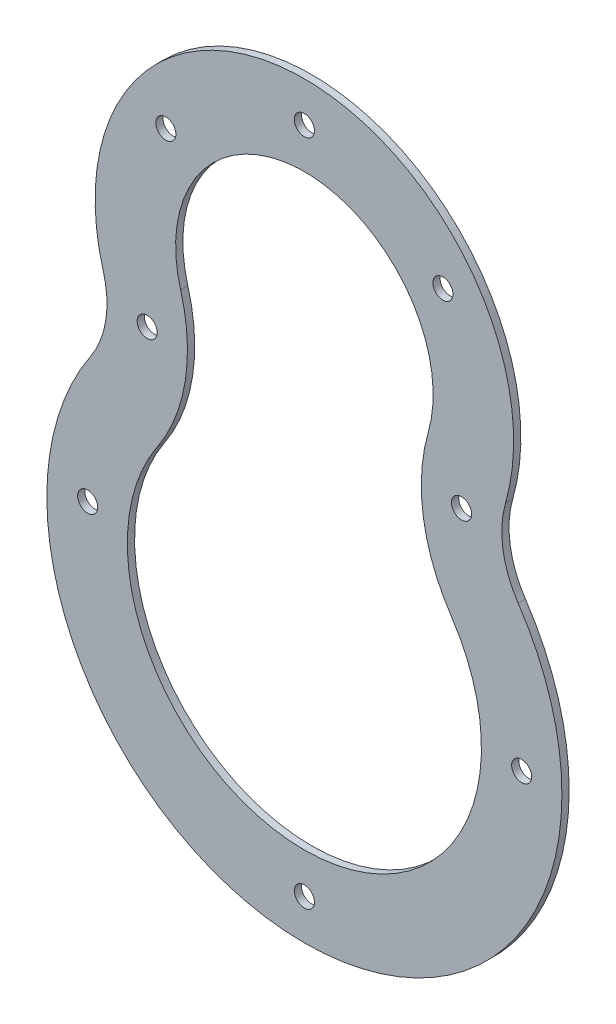
ISO-10303-21;
HEADER;
FILE_DESCRIPTION(('STEP AP214'),'2;1');
FILE_NAME('part.step','',(''),(''),'','','');
FILE_SCHEMA(('AUTOMOTIVE_DESIGN { 1 0 10303 214 1 1 1 1 }'));
ENDSEC;
DATA;
#1=APPLICATION_CONTEXT('core data for automotive mechanical design processes');
#2=APPLICATION_PROTOCOL_DEFINITION('international standard','automotive_design',2000,#1);
#3=PRODUCT_CONTEXT('',#1,'mechanical');
#4=PRODUCT('Part','Part','',(#3));
#5=PRODUCT_RELATED_PRODUCT_CATEGORY('part','',(#4));
#6=PRODUCT_DEFINITION_FORMATION('','',#4);
#7=PRODUCT_DEFINITION_CONTEXT('part definition',#1,'design');
#8=PRODUCT_DEFINITION('design','',#6,#7);
#9=PRODUCT_DEFINITION_SHAPE('','',#8);
#10=(LENGTH_UNIT() NAMED_UNIT(*) SI_UNIT(.MILLI.,.METRE.));
#11=(NAMED_UNIT(*) PLANE_ANGLE_UNIT() SI_UNIT($,.RADIAN.));
#12=(NAMED_UNIT(*) SI_UNIT($,.STERADIAN.) SOLID_ANGLE_UNIT());
#13=UNCERTAINTY_MEASURE_WITH_UNIT(LENGTH_MEASURE(1.E-05),#10,'distance_accuracy_value','');
#14=(GEOMETRIC_REPRESENTATION_CONTEXT(3) GLOBAL_UNCERTAINTY_ASSIGNED_CONTEXT((#13)) GLOBAL_UNIT_ASSIGNED_CONTEXT((#10,
#11,#12)) REPRESENTATION_CONTEXT('',''));
#15=CARTESIAN_POINT('',(0.,0.,0.));
#16=DIRECTION('',(0.,0.,1.));
#17=DIRECTION('',(1.,0.,0.));
#18=AXIS2_PLACEMENT_3D('',#15,#16,#17);
#19=CARTESIAN_POINT('',(18.264372311097,29.7642857142857,0.9));
#20=DIRECTION('',(0.,0.,-1.));
#21=DIRECTION('',(-1.,0.,0.));
#22=AXIS2_PLACEMENT_3D('',#19,#20,#21);
#23=PLANE('',#22);
#24=CARTESIAN_POINT('',(27.,0.,0.900000000000001));
#25=DIRECTION('',(0.,0.,1.));
#26=DIRECTION('',(1.,0.,0.));
#27=AXIS2_PLACEMENT_3D('',#24,#25,#26);
#28=CIRCLE('',#27,1.24999999999999);
#29=CARTESIAN_POINT('',(28.25,0.,0.900000000000001));
#30=VERTEX_POINT('',#29);
#31=EDGE_CURVE('E258',#30,#30,#28,.T.);
#32=ORIENTED_EDGE('',*,*,#31,.F.);
#33=EDGE_LOOP('',(#32));
#34=FACE_BOUND('',#33,.T.);
#35=CARTESIAN_POINT('',(19.528744622194,24.5285714285713,0.900000000000001));
#36=DIRECTION('',(0.,0.,1.));
#37=DIRECTION('',(1.,0.,0.));
#38=AXIS2_PLACEMENT_3D('',#35,#36,#37);
#39=CIRCLE('',#38,1.24999999999999);
#40=CARTESIAN_POINT('',(20.778744622194,24.5285714285713,0.900000000000001));
#41=VERTEX_POINT('',#40);
#42=EDGE_CURVE('E260',#41,#41,#39,.T.);
#43=ORIENTED_EDGE('',*,*,#42,.F.);
#44=EDGE_LOOP('',(#43));
#45=FACE_BOUND('',#44,.T.);
#46=CARTESIAN_POINT('',(-19.528744622194,24.5285714285714,0.900000000000001));
#47=DIRECTION('',(0.,0.,1.));
#48=DIRECTION('',(1.,0.,0.));
#49=AXIS2_PLACEMENT_3D('',#46,#47,#48);
#50=CIRCLE('',#49,1.24999999999999);
#51=CARTESIAN_POINT('',(-18.278744622194,24.5285714285714,0.900000000000001));
#52=VERTEX_POINT('',#51);
#53=EDGE_CURVE('E268',#52,#52,#50,.T.);
#54=ORIENTED_EDGE('',*,*,#53,.F.);
#55=EDGE_LOOP('',(#54));
#56=FACE_BOUND('',#55,.T.);
#57=CARTESIAN_POINT('',(-26.9236865595925,2.02857142857143,0.900000000000001));
#58=DIRECTION('',(0.,0.,1.));
#59=DIRECTION('',(1.,0.,0.));
#60=AXIS2_PLACEMENT_3D('',#57,#58,#59);
#61=CIRCLE('',#60,1.24999999999999);
#62=CARTESIAN_POINT('',(-25.6736865595925,2.02857142857143,0.900000000000001));
#63=VERTEX_POINT('',#62);
#64=EDGE_CURVE('E274',#63,#63,#61,.T.);
#65=ORIENTED_EDGE('',*,*,#64,.F.);
#66=EDGE_LOOP('',(#65));
#67=FACE_BOUND('',#66,.T.);
#68=CARTESIAN_POINT('',(0.,56.,0.900000000000001));
#69=DIRECTION('',(0.,0.,1.));
#70=DIRECTION('',(1.,0.,0.));
#71=AXIS2_PLACEMENT_3D('',#68,#69,#70);
#72=CIRCLE('',#71,1.24999999999999);
#73=CARTESIAN_POINT('',(1.24999999999999,56.,0.900000000000001));
#74=VERTEX_POINT('',#73);
#75=EDGE_CURVE('E280',#74,#74,#72,.T.);
#76=ORIENTED_EDGE('',*,*,#75,.F.);
#77=EDGE_LOOP('',(#76));
#78=FACE_BOUND('',#77,.T.);
#79=CARTESIAN_POINT('',(17.2137581424788,47.0285714285714,0.900000000000001));
#80=DIRECTION('',(0.,0.,1.));
#81=DIRECTION('',(1.,0.,0.));
#82=AXIS2_PLACEMENT_3D('',#79,#80,#81);
#83=CIRCLE('',#82,1.24999999999999);
#84=CARTESIAN_POINT('',(18.4637581424788,47.0285714285714,0.900000000000001));
#85=VERTEX_POINT('',#84);
#86=EDGE_CURVE('E286',#85,#85,#83,.T.);
#87=ORIENTED_EDGE('',*,*,#86,.F.);
#88=EDGE_LOOP('',(#87));
#89=FACE_BOUND('',#88,.T.);
#90=CARTESIAN_POINT('',(-17.2137581424788,47.0285714285714,0.900000000000001));
#91=DIRECTION('',(0.,0.,1.));
#92=DIRECTION('',(1.,0.,0.));
#93=AXIS2_PLACEMENT_3D('',#90,#91,#92);
#94=CIRCLE('',#93,1.24999999999999);
#95=CARTESIAN_POINT('',(-15.9637581424788,47.0285714285714,0.900000000000001));
#96=VERTEX_POINT('',#95);
#97=EDGE_CURVE('E292',#96,#96,#94,.T.);
#98=ORIENTED_EDGE('',*,*,#97,.F.);
#99=EDGE_LOOP('',(#98));
#100=FACE_BOUND('',#99,.T.);
#101=CARTESIAN_POINT('',(0.,-27.,0.900000000000001));
#102=DIRECTION('',(0.,0.,1.));
#103=DIRECTION('',(1.,0.,0.));
#104=AXIS2_PLACEMENT_3D('',#101,#102,#103);
#105=CIRCLE('',#104,1.24999999999999);
#106=CARTESIAN_POINT('',(1.24999999999998,-27.,0.900000000000001));
#107=VERTEX_POINT('',#106);
#108=EDGE_CURVE('E298',#107,#107,#105,.T.);
#109=ORIENTED_EDGE('',*,*,#108,.F.);
#110=EDGE_LOOP('',(#109));
#111=FACE_BOUND('',#110,.T.);
#112=CARTESIAN_POINT('',(0.,35.,0.9));
#113=DIRECTION('',(0.,0.,1.));
#114=DIRECTION('',(-1.,0.,0.));
#115=AXIS2_PLACEMENT_3D('',#112,#113,#114);
#116=CIRCLE('',#115,26.);
#117=CARTESIAN_POINT('',(24.9933515836064,27.8353383458647,0.9));
#118=VERTEX_POINT('',#117);
#119=CARTESIAN_POINT('',(-24.9933515836064,27.8353383458647,0.9));
#120=VERTEX_POINT('',#119);
#121=EDGE_CURVE('E140',#118,#120,#116,.T.);
#122=ORIENTED_EDGE('',*,*,#121,.T.);
#123=CARTESIAN_POINT('',(-36.528744622194,24.5285714285714,0.9));
#124=DIRECTION('',(0.,0.,-1.));
#125=DIRECTION('',(-1.,0.,0.));
#126=AXIS2_PLACEMENT_3D('',#123,#124,#125);
#127=CIRCLE('',#126,12.);
#128=CARTESIAN_POINT('',(-26.566359725232,17.838961038961,0.9));
#129=VERTEX_POINT('',#128);
#130=EDGE_CURVE('E143',#120,#129,#127,.T.);
#131=ORIENTED_EDGE('',*,*,#130,.T.);
#132=CARTESIAN_POINT('',(0.,0.,0.9));
#133=DIRECTION('',(0.,0.,1.));
#134=DIRECTION('',(1.,0.,0.));
#135=AXIS2_PLACEMENT_3D('',#132,#133,#134);
#136=CIRCLE('',#135,32.);
#137=CARTESIAN_POINT('',(26.566359725232,17.838961038961,0.9));
#138=VERTEX_POINT('',#137);
#139=EDGE_CURVE('E146',#129,#138,#136,.T.);
#140=ORIENTED_EDGE('',*,*,#139,.T.);
#141=CARTESIAN_POINT('',(36.528744622194,24.5285714285714,0.9));
#142=DIRECTION('',(0.,0.,-1.));
#143=DIRECTION('',(1.,0.,0.));
#144=AXIS2_PLACEMENT_3D('',#141,#142,#143);
#145=CIRCLE('',#144,12.);
#146=EDGE_CURVE('E148',#138,#118,#145,.T.);
#147=ORIENTED_EDGE('',*,*,#146,.T.);
#148=EDGE_LOOP('',(#122,#131,#140,#147));
#149=FACE_BOUND('',#148,.T.);
#150=CARTESIAN_POINT('',(-36.528744622194,24.5285714285714,0.9));
#151=DIRECTION('',(0.,0.,-1.));
#152=DIRECTION('',(-1.,0.,0.));
#153=AXIS2_PLACEMENT_3D('',#150,#151,#152);
#154=CIRCLE('',#153,22.);
#155=CARTESIAN_POINT('',(-15.3805240514501,30.590977443609,0.9));
#156=VERTEX_POINT('',#155);
#157=CARTESIAN_POINT('',(-18.264372311097,12.2642857142857,0.9));
#158=VERTEX_POINT('',#157);
#159=EDGE_CURVE('E102',#156,#158,#154,.T.);
#160=ORIENTED_EDGE('',*,*,#159,.F.);
#161=CARTESIAN_POINT('',(0.,35.,0.9));
#162=DIRECTION('',(0.,0.,1.));
#163=DIRECTION('',(-1.,0.,0.));
#164=AXIS2_PLACEMENT_3D('',#161,#162,#163);
#165=CIRCLE('',#164,16.);
#166=CARTESIAN_POINT('',(15.3805240514501,30.590977443609,0.9));
#167=VERTEX_POINT('',#166);
#168=EDGE_CURVE('E124',#167,#156,#165,.T.);
#169=ORIENTED_EDGE('',*,*,#168,.F.);
#170=CARTESIAN_POINT('',(36.528744622194,24.5285714285714,0.9));
#171=DIRECTION('',(0.,0.,-1.));
#172=DIRECTION('',(1.,0.,0.));
#173=AXIS2_PLACEMENT_3D('',#170,#171,#172);
#174=CIRCLE('',#173,22.);
#175=CARTESIAN_POINT('',(18.264372311097,12.2642857142857,0.9));
#176=VERTEX_POINT('',#175);
#177=EDGE_CURVE('E122',#176,#167,#174,.T.);
#178=ORIENTED_EDGE('',*,*,#177,.F.);
#179=CARTESIAN_POINT('',(0.,0.,0.9));
#180=DIRECTION('',(0.,0.,1.));
#181=DIRECTION('',(1.,0.,0.));
#182=AXIS2_PLACEMENT_3D('',#179,#180,#181);
#183=CIRCLE('',#182,22.);
#184=EDGE_CURVE('E110',#158,#176,#183,.T.);
#185=ORIENTED_EDGE('',*,*,#184,.F.);
#186=EDGE_LOOP('',(#160,#169,#178,#185));
#187=FACE_BOUND('',#186,.T.);
#188=ADVANCED_FACE('F37',(#34,#45,#56,#67,#78,#89,#100,#111,#149,#187),#23,.F.);
#189=CARTESIAN_POINT('',(18.264372311097,29.7642857142857,0.));
#190=DIRECTION('',(0.,0.,-1.));
#191=DIRECTION('',(-1.,0.,0.));
#192=AXIS2_PLACEMENT_3D('',#189,#190,#191);
#193=PLANE('',#192);
#194=CARTESIAN_POINT('',(27.,0.,0.));
#195=DIRECTION('',(0.,0.,1.));
#196=DIRECTION('',(1.,0.,0.));
#197=AXIS2_PLACEMENT_3D('',#194,#195,#196);
#198=CIRCLE('',#197,1.25);
#199=CARTESIAN_POINT('',(28.25,0.,0.));
#200=VERTEX_POINT('',#199);
#201=EDGE_CURVE('E256',#200,#200,#198,.T.);
#202=ORIENTED_EDGE('',*,*,#201,.T.);
#203=EDGE_LOOP('',(#202));
#204=FACE_BOUND('',#203,.T.);
#205=CARTESIAN_POINT('',(19.528744622194,24.5285714285713,0.));
#206=DIRECTION('',(0.,0.,1.));
#207=DIRECTION('',(1.,0.,0.));
#208=AXIS2_PLACEMENT_3D('',#205,#206,#207);
#209=CIRCLE('',#208,1.25);
#210=CARTESIAN_POINT('',(20.778744622194,24.5285714285713,0.));
#211=VERTEX_POINT('',#210);
#212=EDGE_CURVE('E265',#211,#211,#209,.T.);
#213=ORIENTED_EDGE('',*,*,#212,.T.);
#214=EDGE_LOOP('',(#213));
#215=FACE_BOUND('',#214,.T.);
#216=CARTESIAN_POINT('',(-19.528744622194,24.5285714285714,0.));
#217=DIRECTION('',(0.,0.,1.));
#218=DIRECTION('',(1.,0.,0.));
#219=AXIS2_PLACEMENT_3D('',#216,#217,#218);
#220=CIRCLE('',#219,1.25);
#221=CARTESIAN_POINT('',(-18.278744622194,24.5285714285714,0.));
#222=VERTEX_POINT('',#221);
#223=EDGE_CURVE('E271',#222,#222,#220,.T.);
#224=ORIENTED_EDGE('',*,*,#223,.T.);
#225=EDGE_LOOP('',(#224));
#226=FACE_BOUND('',#225,.T.);
#227=CARTESIAN_POINT('',(-26.9236865595925,2.02857142857143,0.));
#228=DIRECTION('',(0.,0.,1.));
#229=DIRECTION('',(1.,0.,0.));
#230=AXIS2_PLACEMENT_3D('',#227,#228,#229);
#231=CIRCLE('',#230,1.25);
#232=CARTESIAN_POINT('',(-25.6736865595925,2.02857142857143,0.));
#233=VERTEX_POINT('',#232);
#234=EDGE_CURVE('E277',#233,#233,#231,.T.);
#235=ORIENTED_EDGE('',*,*,#234,.T.);
#236=EDGE_LOOP('',(#235));
#237=FACE_BOUND('',#236,.T.);
#238=CARTESIAN_POINT('',(0.,56.,0.));
#239=DIRECTION('',(0.,0.,1.));
#240=DIRECTION('',(1.,0.,0.));
#241=AXIS2_PLACEMENT_3D('',#238,#239,#240);
#242=CIRCLE('',#241,1.25);
#243=CARTESIAN_POINT('',(1.25,56.,0.));
#244=VERTEX_POINT('',#243);
#245=EDGE_CURVE('E283',#244,#244,#242,.T.);
#246=ORIENTED_EDGE('',*,*,#245,.T.);
#247=EDGE_LOOP('',(#246));
#248=FACE_BOUND('',#247,.T.);
#249=CARTESIAN_POINT('',(17.2137581424788,47.0285714285714,0.));
#250=DIRECTION('',(0.,0.,1.));
#251=DIRECTION('',(1.,0.,0.));
#252=AXIS2_PLACEMENT_3D('',#249,#250,#251);
#253=CIRCLE('',#252,1.25);
#254=CARTESIAN_POINT('',(18.4637581424788,47.0285714285714,0.));
#255=VERTEX_POINT('',#254);
#256=EDGE_CURVE('E289',#255,#255,#253,.T.);
#257=ORIENTED_EDGE('',*,*,#256,.T.);
#258=EDGE_LOOP('',(#257));
#259=FACE_BOUND('',#258,.T.);
#260=CARTESIAN_POINT('',(-17.2137581424788,47.0285714285714,0.));
#261=DIRECTION('',(0.,0.,1.));
#262=DIRECTION('',(1.,0.,0.));
#263=AXIS2_PLACEMENT_3D('',#260,#261,#262);
#264=CIRCLE('',#263,1.25);
#265=CARTESIAN_POINT('',(-15.9637581424788,47.0285714285714,0.));
#266=VERTEX_POINT('',#265);
#267=EDGE_CURVE('E295',#266,#266,#264,.T.);
#268=ORIENTED_EDGE('',*,*,#267,.T.);
#269=EDGE_LOOP('',(#268));
#270=FACE_BOUND('',#269,.T.);
#271=CARTESIAN_POINT('',(0.,-27.,0.));
#272=DIRECTION('',(0.,0.,1.));
#273=DIRECTION('',(1.,0.,0.));
#274=AXIS2_PLACEMENT_3D('',#271,#272,#273);
#275=CIRCLE('',#274,1.25);
#276=CARTESIAN_POINT('',(1.24999999999999,-27.,0.));
#277=VERTEX_POINT('',#276);
#278=EDGE_CURVE('E130',#277,#277,#275,.T.);
#279=ORIENTED_EDGE('',*,*,#278,.T.);
#280=EDGE_LOOP('',(#279));
#281=FACE_BOUND('',#280,.T.);
#282=CARTESIAN_POINT('',(0.,35.,0.));
#283=DIRECTION('',(0.,0.,1.));
#284=DIRECTION('',(-1.,0.,0.));
#285=AXIS2_PLACEMENT_3D('',#282,#283,#284);
#286=CIRCLE('',#285,26.);
#287=CARTESIAN_POINT('',(24.9933515836064,27.8353383458647,0.));
#288=VERTEX_POINT('',#287);
#289=CARTESIAN_POINT('',(-24.9933515836064,27.8353383458647,0.));
#290=VERTEX_POINT('',#289);
#291=EDGE_CURVE('E118',#288,#290,#286,.T.);
#292=ORIENTED_EDGE('',*,*,#291,.F.);
#293=CARTESIAN_POINT('',(36.528744622194,24.5285714285714,0.));
#294=DIRECTION('',(0.,0.,-1.));
#295=DIRECTION('',(1.,0.,0.));
#296=AXIS2_PLACEMENT_3D('',#293,#294,#295);
#297=CIRCLE('',#296,12.);
#298=CARTESIAN_POINT('',(26.566359725232,17.838961038961,0.));
#299=VERTEX_POINT('',#298);
#300=EDGE_CURVE('E144',#299,#288,#297,.T.);
#301=ORIENTED_EDGE('',*,*,#300,.F.);
#302=CARTESIAN_POINT('',(0.,0.,0.));
#303=DIRECTION('',(0.,0.,1.));
#304=DIRECTION('',(1.,0.,0.));
#305=AXIS2_PLACEMENT_3D('',#302,#303,#304);
#306=CIRCLE('',#305,32.);
#307=CARTESIAN_POINT('',(-26.566359725232,17.838961038961,0.));
#308=VERTEX_POINT('',#307);
#309=EDGE_CURVE('E155',#308,#299,#306,.T.);
#310=ORIENTED_EDGE('',*,*,#309,.F.);
#311=CARTESIAN_POINT('',(-36.528744622194,24.5285714285714,0.));
#312=DIRECTION('',(0.,0.,-1.));
#313=DIRECTION('',(-1.,0.,0.));
#314=AXIS2_PLACEMENT_3D('',#311,#312,#313);
#315=CIRCLE('',#314,12.);
#316=EDGE_CURVE('E153',#290,#308,#315,.T.);
#317=ORIENTED_EDGE('',*,*,#316,.F.);
#318=EDGE_LOOP('',(#292,#301,#310,#317));
#319=FACE_BOUND('',#318,.T.);
#320=CARTESIAN_POINT('',(0.,35.,0.));
#321=DIRECTION('',(0.,0.,1.));
#322=DIRECTION('',(-1.,0.,0.));
#323=AXIS2_PLACEMENT_3D('',#320,#321,#322);
#324=CIRCLE('',#323,16.);
#325=CARTESIAN_POINT('',(15.3805240514501,30.590977443609,0.));
#326=VERTEX_POINT('',#325);
#327=CARTESIAN_POINT('',(-15.3805240514501,30.590977443609,0.));
#328=VERTEX_POINT('',#327);
#329=EDGE_CURVE('E111',#326,#328,#324,.T.);
#330=ORIENTED_EDGE('',*,*,#329,.T.);
#331=CARTESIAN_POINT('',(-36.528744622194,24.5285714285714,0.));
#332=DIRECTION('',(0.,0.,-1.));
#333=DIRECTION('',(-1.,0.,0.));
#334=AXIS2_PLACEMENT_3D('',#331,#332,#333);
#335=CIRCLE('',#334,22.);
#336=CARTESIAN_POINT('',(-18.264372311097,12.2642857142857,0.));
#337=VERTEX_POINT('',#336);
#338=EDGE_CURVE('E60',#328,#337,#335,.T.);
#339=ORIENTED_EDGE('',*,*,#338,.T.);
#340=CARTESIAN_POINT('',(0.,0.,0.));
#341=DIRECTION('',(0.,0.,1.));
#342=DIRECTION('',(1.,0.,0.));
#343=AXIS2_PLACEMENT_3D('',#340,#341,#342);
#344=CIRCLE('',#343,22.);
#345=CARTESIAN_POINT('',(18.264372311097,12.2642857142857,0.));
#346=VERTEX_POINT('',#345);
#347=EDGE_CURVE('E117',#337,#346,#344,.T.);
#348=ORIENTED_EDGE('',*,*,#347,.T.);
#349=CARTESIAN_POINT('',(36.528744622194,24.5285714285714,0.));
#350=DIRECTION('',(0.,0.,-1.));
#351=DIRECTION('',(1.,0.,0.));
#352=AXIS2_PLACEMENT_3D('',#349,#350,#351);
#353=CIRCLE('',#352,22.);
#354=EDGE_CURVE('E132',#346,#326,#353,.T.);
#355=ORIENTED_EDGE('',*,*,#354,.T.);
#356=EDGE_LOOP('',(#330,#339,#348,#355));
#357=FACE_BOUND('',#356,.T.);
#358=ADVANCED_FACE('F173',(#204,#215,#226,#237,#248,#259,#270,#281,#319,#357),#193,.T.);
#359=CARTESIAN_POINT('',(0.,35.,0.9));
#360=DIRECTION('',(0.,0.,-1.));
#361=DIRECTION('',(-1.,0.,0.));
#362=AXIS2_PLACEMENT_3D('',#359,#360,#361);
#363=CYLINDRICAL_SURFACE('',#362,26.);
#364=ORIENTED_EDGE('',*,*,#291,.T.);
#365=DIRECTION('',(0.,0.,-1.));
#366=VECTOR('',#365,1.);
#367=CARTESIAN_POINT('',(-24.9933515836064,27.8353383458647,0.9));
#368=LINE('',#367,#366);
#369=EDGE_CURVE('E11',#120,#290,#368,.T.);
#370=ORIENTED_EDGE('',*,*,#369,.F.);
#371=ORIENTED_EDGE('',*,*,#121,.F.);
#372=DIRECTION('',(0.,0.,-1.));
#373=VECTOR('',#372,1.);
#374=CARTESIAN_POINT('',(24.9933515836064,27.8353383458647,0.9));
#375=LINE('',#374,#373);
#376=EDGE_CURVE('E150',#118,#288,#375,.T.);
#377=ORIENTED_EDGE('',*,*,#376,.T.);
#378=EDGE_LOOP('',(#364,#370,#371,#377));
#379=FACE_BOUND('',#378,.T.);
#380=ADVANCED_FACE('F39',(#379),#363,.T.);
#381=CARTESIAN_POINT('',(-36.528744622194,24.5285714285714,0.9));
#382=DIRECTION('',(0.,0.,-1.));
#383=DIRECTION('',(-1.,0.,0.));
#384=AXIS2_PLACEMENT_3D('',#381,#382,#383);
#385=CYLINDRICAL_SURFACE('',#384,12.);
#386=ORIENTED_EDGE('',*,*,#316,.T.);
#387=DIRECTION('',(0.,0.,-1.));
#388=VECTOR('',#387,1.);
#389=CARTESIAN_POINT('',(-26.566359725232,17.838961038961,0.9));
#390=LINE('',#389,#388);
#391=EDGE_CURVE('E45',#129,#308,#390,.T.);
#392=ORIENTED_EDGE('',*,*,#391,.F.);
#393=ORIENTED_EDGE('',*,*,#130,.F.);
#394=ORIENTED_EDGE('',*,*,#369,.T.);
#395=EDGE_LOOP('',(#386,#392,#393,#394));
#396=FACE_BOUND('',#395,.T.);
#397=ADVANCED_FACE('F183',(#396),#385,.F.);
#398=CARTESIAN_POINT('',(0.,0.,0.9));
#399=DIRECTION('',(0.,0.,-1.));
#400=DIRECTION('',(-1.,0.,0.));
#401=AXIS2_PLACEMENT_3D('',#398,#399,#400);
#402=CYLINDRICAL_SURFACE('',#401,32.);
#403=ORIENTED_EDGE('',*,*,#309,.T.);
#404=DIRECTION('',(0.,0.,-1.));
#405=VECTOR('',#404,1.);
#406=CARTESIAN_POINT('',(26.566359725232,17.838961038961,0.9));
#407=LINE('',#406,#405);
#408=EDGE_CURVE('E160',#138,#299,#407,.T.);
#409=ORIENTED_EDGE('',*,*,#408,.F.);
#410=ORIENTED_EDGE('',*,*,#139,.F.);
#411=ORIENTED_EDGE('',*,*,#391,.T.);
#412=EDGE_LOOP('',(#403,#409,#410,#411));
#413=FACE_BOUND('',#412,.T.);
#414=ADVANCED_FACE('F167',(#413),#402,.T.);
#415=CARTESIAN_POINT('',(36.528744622194,24.5285714285714,0.9));
#416=DIRECTION('',(0.,0.,-1.));
#417=DIRECTION('',(-1.,0.,0.));
#418=AXIS2_PLACEMENT_3D('',#415,#416,#417);
#419=CYLINDRICAL_SURFACE('',#418,12.);
#420=ORIENTED_EDGE('',*,*,#300,.T.);
#421=ORIENTED_EDGE('',*,*,#376,.F.);
#422=ORIENTED_EDGE('',*,*,#146,.F.);
#423=ORIENTED_EDGE('',*,*,#408,.T.);
#424=EDGE_LOOP('',(#420,#421,#422,#423));
#425=FACE_BOUND('',#424,.T.);
#426=ADVANCED_FACE('F177',(#425),#419,.F.);
#427=CARTESIAN_POINT('',(-36.528744622194,24.5285714285714,0.9));
#428=DIRECTION('',(0.,0.,-1.));
#429=DIRECTION('',(-1.,0.,0.));
#430=AXIS2_PLACEMENT_3D('',#427,#428,#429);
#431=CYLINDRICAL_SURFACE('',#430,22.);
#432=ORIENTED_EDGE('',*,*,#338,.F.);
#433=DIRECTION('',(0.,0.,-1.));
#434=VECTOR('',#433,1.);
#435=CARTESIAN_POINT('',(-15.3805240514501,30.590977443609,0.9));
#436=LINE('',#435,#434);
#437=EDGE_CURVE('E106',#156,#328,#436,.T.);
#438=ORIENTED_EDGE('',*,*,#437,.F.);
#439=ORIENTED_EDGE('',*,*,#159,.T.);
#440=DIRECTION('',(0.,0.,-1.));
#441=VECTOR('',#440,1.);
#442=CARTESIAN_POINT('',(-18.264372311097,12.2642857142857,0.9));
#443=LINE('',#442,#441);
#444=EDGE_CURVE('E105',#158,#337,#443,.T.);
#445=ORIENTED_EDGE('',*,*,#444,.T.);
#446=EDGE_LOOP('',(#432,#438,#439,#445));
#447=FACE_BOUND('',#446,.T.);
#448=ADVANCED_FACE('F104',(#447),#431,.T.);
#449=CARTESIAN_POINT('',(0.,0.,0.9));
#450=DIRECTION('',(0.,0.,-1.));
#451=DIRECTION('',(-1.,0.,0.));
#452=AXIS2_PLACEMENT_3D('',#449,#450,#451);
#453=CYLINDRICAL_SURFACE('',#452,22.);
#454=ORIENTED_EDGE('',*,*,#347,.F.);
#455=ORIENTED_EDGE('',*,*,#444,.F.);
#456=ORIENTED_EDGE('',*,*,#184,.T.);
#457=DIRECTION('',(0.,0.,-1.));
#458=VECTOR('',#457,1.);
#459=CARTESIAN_POINT('',(18.264372311097,12.2642857142857,0.9));
#460=LINE('',#459,#458);
#461=EDGE_CURVE('E119',#176,#346,#460,.T.);
#462=ORIENTED_EDGE('',*,*,#461,.T.);
#463=EDGE_LOOP('',(#454,#455,#456,#462));
#464=FACE_BOUND('',#463,.T.);
#465=ADVANCED_FACE('F114',(#464),#453,.F.);
#466=CARTESIAN_POINT('',(36.528744622194,24.5285714285714,0.9));
#467=DIRECTION('',(0.,0.,-1.));
#468=DIRECTION('',(-1.,0.,0.));
#469=AXIS2_PLACEMENT_3D('',#466,#467,#468);
#470=CYLINDRICAL_SURFACE('',#469,22.);
#471=ORIENTED_EDGE('',*,*,#354,.F.);
#472=ORIENTED_EDGE('',*,*,#461,.F.);
#473=ORIENTED_EDGE('',*,*,#177,.T.);
#474=DIRECTION('',(0.,0.,-1.));
#475=VECTOR('',#474,1.);
#476=CARTESIAN_POINT('',(15.3805240514501,30.590977443609,0.9));
#477=LINE('',#476,#475);
#478=EDGE_CURVE('E52',#167,#326,#477,.T.);
#479=ORIENTED_EDGE('',*,*,#478,.T.);
#480=EDGE_LOOP('',(#471,#472,#473,#479));
#481=FACE_BOUND('',#480,.T.);
#482=ADVANCED_FACE('F210',(#481),#470,.T.);
#483=CARTESIAN_POINT('',(0.,35.,0.9));
#484=DIRECTION('',(0.,0.,-1.));
#485=DIRECTION('',(-1.,0.,0.));
#486=AXIS2_PLACEMENT_3D('',#483,#484,#485);
#487=CYLINDRICAL_SURFACE('',#486,16.);
#488=ORIENTED_EDGE('',*,*,#329,.F.);
#489=ORIENTED_EDGE('',*,*,#478,.F.);
#490=ORIENTED_EDGE('',*,*,#168,.T.);
#491=ORIENTED_EDGE('',*,*,#437,.T.);
#492=EDGE_LOOP('',(#488,#489,#490,#491));
#493=FACE_BOUND('',#492,.T.);
#494=ADVANCED_FACE('F214',(#493),#487,.F.);
#495=CARTESIAN_POINT('',(0.,-27.,0.9));
#496=DIRECTION('',(0.,0.,1.));
#497=DIRECTION('',(1.,0.,0.));
#498=AXIS2_PLACEMENT_3D('',#495,#496,#497);
#499=CYLINDRICAL_SURFACE('',#498,1.24999999999999);
#500=ORIENTED_EDGE('',*,*,#278,.F.);
#501=EDGE_LOOP('',(#500));
#502=FACE_BOUND('',#501,.T.);
#503=ORIENTED_EDGE('',*,*,#108,.T.);
#504=EDGE_LOOP('',(#503));
#505=FACE_BOUND('',#504,.T.);
#506=ADVANCED_FACE('F220',(#502,#505),#499,.F.);
#507=CARTESIAN_POINT('',(-17.2137581424788,47.0285714285714,0.9));
#508=DIRECTION('',(0.,0.,1.));
#509=DIRECTION('',(1.,0.,0.));
#510=AXIS2_PLACEMENT_3D('',#507,#508,#509);
#511=CYLINDRICAL_SURFACE('',#510,1.24999999999999);
#512=ORIENTED_EDGE('',*,*,#267,.F.);
#513=EDGE_LOOP('',(#512));
#514=FACE_BOUND('',#513,.T.);
#515=ORIENTED_EDGE('',*,*,#97,.T.);
#516=EDGE_LOOP('',(#515));
#517=FACE_BOUND('',#516,.T.);
#518=ADVANCED_FACE('F223',(#514,#517),#511,.F.);
#519=CARTESIAN_POINT('',(17.2137581424788,47.0285714285714,0.9));
#520=DIRECTION('',(0.,0.,1.));
#521=DIRECTION('',(1.,0.,0.));
#522=AXIS2_PLACEMENT_3D('',#519,#520,#521);
#523=CYLINDRICAL_SURFACE('',#522,1.24999999999999);
#524=ORIENTED_EDGE('',*,*,#256,.F.);
#525=EDGE_LOOP('',(#524));
#526=FACE_BOUND('',#525,.T.);
#527=ORIENTED_EDGE('',*,*,#86,.T.);
#528=EDGE_LOOP('',(#527));
#529=FACE_BOUND('',#528,.T.);
#530=ADVANCED_FACE('F227',(#526,#529),#523,.F.);
#531=CARTESIAN_POINT('',(0.,56.,0.9));
#532=DIRECTION('',(0.,0.,1.));
#533=DIRECTION('',(1.,0.,0.));
#534=AXIS2_PLACEMENT_3D('',#531,#532,#533);
#535=CYLINDRICAL_SURFACE('',#534,1.24999999999999);
#536=ORIENTED_EDGE('',*,*,#245,.F.);
#537=EDGE_LOOP('',(#536));
#538=FACE_BOUND('',#537,.T.);
#539=ORIENTED_EDGE('',*,*,#75,.T.);
#540=EDGE_LOOP('',(#539));
#541=FACE_BOUND('',#540,.T.);
#542=ADVANCED_FACE('F231',(#538,#541),#535,.F.);
#543=CARTESIAN_POINT('',(-26.9236865595925,2.02857142857143,0.9));
#544=DIRECTION('',(0.,0.,1.));
#545=DIRECTION('',(1.,0.,0.));
#546=AXIS2_PLACEMENT_3D('',#543,#544,#545);
#547=CYLINDRICAL_SURFACE('',#546,1.24999999999999);
#548=ORIENTED_EDGE('',*,*,#234,.F.);
#549=EDGE_LOOP('',(#548));
#550=FACE_BOUND('',#549,.T.);
#551=ORIENTED_EDGE('',*,*,#64,.T.);
#552=EDGE_LOOP('',(#551));
#553=FACE_BOUND('',#552,.T.);
#554=ADVANCED_FACE('F235',(#550,#553),#547,.F.);
#555=CARTESIAN_POINT('',(-19.528744622194,24.5285714285714,0.9));
#556=DIRECTION('',(0.,0.,1.));
#557=DIRECTION('',(1.,0.,0.));
#558=AXIS2_PLACEMENT_3D('',#555,#556,#557);
#559=CYLINDRICAL_SURFACE('',#558,1.24999999999999);
#560=ORIENTED_EDGE('',*,*,#223,.F.);
#561=EDGE_LOOP('',(#560));
#562=FACE_BOUND('',#561,.T.);
#563=ORIENTED_EDGE('',*,*,#53,.T.);
#564=EDGE_LOOP('',(#563));
#565=FACE_BOUND('',#564,.T.);
#566=ADVANCED_FACE('F239',(#562,#565),#559,.F.);
#567=CARTESIAN_POINT('',(19.528744622194,24.5285714285713,0.9));
#568=DIRECTION('',(0.,0.,1.));
#569=DIRECTION('',(1.,0.,0.));
#570=AXIS2_PLACEMENT_3D('',#567,#568,#569);
#571=CYLINDRICAL_SURFACE('',#570,1.24999999999999);
#572=ORIENTED_EDGE('',*,*,#212,.F.);
#573=EDGE_LOOP('',(#572));
#574=FACE_BOUND('',#573,.T.);
#575=ORIENTED_EDGE('',*,*,#42,.T.);
#576=EDGE_LOOP('',(#575));
#577=FACE_BOUND('',#576,.T.);
#578=ADVANCED_FACE('F243',(#574,#577),#571,.F.);
#579=CARTESIAN_POINT('',(27.,0.,0.9));
#580=DIRECTION('',(0.,0.,1.));
#581=DIRECTION('',(1.,0.,0.));
#582=AXIS2_PLACEMENT_3D('',#579,#580,#581);
#583=CYLINDRICAL_SURFACE('',#582,1.24999999999999);
#584=ORIENTED_EDGE('',*,*,#201,.F.);
#585=EDGE_LOOP('',(#584));
#586=FACE_BOUND('',#585,.T.);
#587=ORIENTED_EDGE('',*,*,#31,.T.);
#588=EDGE_LOOP('',(#587));
#589=FACE_BOUND('',#588,.T.);
#590=ADVANCED_FACE('F247',(#586,#589),#583,.F.);
#591=CLOSED_SHELL('',(#188,#358,#380,#397,#414,#426,#448,#465,#482,#494,#506,#518,#530,#542,
#554,#566,#578,#590));
#592=MANIFOLD_SOLID_BREP('B2',#591);
#593=ADVANCED_BREP_SHAPE_REPRESENTATION('',(#18,#592),#14);
#594=SHAPE_DEFINITION_REPRESENTATION(#9,#593);
ENDSEC;
END-ISO-10303-21;
